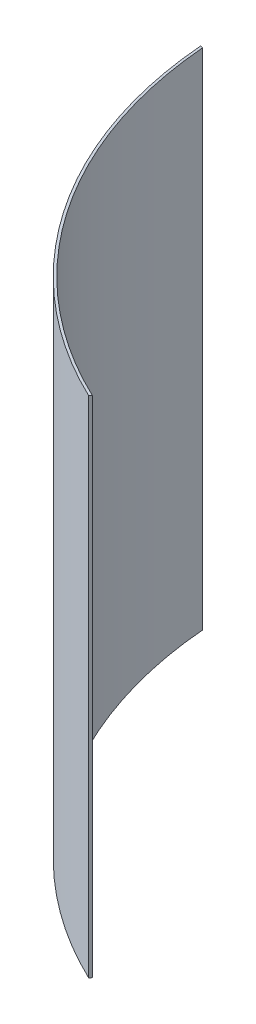
ISO-10303-21;
HEADER;
FILE_DESCRIPTION(('STEP AP214'),'2;1');
FILE_NAME('part.step','',(''),(''),'','','');
FILE_SCHEMA(('AUTOMOTIVE_DESIGN { 1 0 10303 214 1 1 1 1 }'));
ENDSEC;
DATA;
#1=APPLICATION_CONTEXT('core data for automotive mechanical design processes');
#2=APPLICATION_PROTOCOL_DEFINITION('international standard','automotive_design',2000,#1);
#3=PRODUCT_CONTEXT('',#1,'mechanical');
#4=PRODUCT('Part','Part','',(#3));
#5=PRODUCT_RELATED_PRODUCT_CATEGORY('part','',(#4));
#6=PRODUCT_DEFINITION_FORMATION('','',#4);
#7=PRODUCT_DEFINITION_CONTEXT('part definition',#1,'design');
#8=PRODUCT_DEFINITION('design','',#6,#7);
#9=PRODUCT_DEFINITION_SHAPE('','',#8);
#10=(LENGTH_UNIT() NAMED_UNIT(*) SI_UNIT(.MILLI.,.METRE.));
#11=(NAMED_UNIT(*) PLANE_ANGLE_UNIT() SI_UNIT($,.RADIAN.));
#12=(NAMED_UNIT(*) SI_UNIT($,.STERADIAN.) SOLID_ANGLE_UNIT());
#13=UNCERTAINTY_MEASURE_WITH_UNIT(LENGTH_MEASURE(1.E-05),#10,'distance_accuracy_value','');
#14=(GEOMETRIC_REPRESENTATION_CONTEXT(3) GLOBAL_UNCERTAINTY_ASSIGNED_CONTEXT((#13)) GLOBAL_UNIT_ASSIGNED_CONTEXT((#10,
#11,#12)) REPRESENTATION_CONTEXT('',''));
#15=CARTESIAN_POINT('',(0.,0.,0.));
#16=DIRECTION('',(0.,0.,1.));
#17=DIRECTION('',(1.,0.,0.));
#18=AXIS2_PLACEMENT_3D('',#15,#16,#17);
#19=CARTESIAN_POINT('',(0.,2025.87,0.));
#20=DIRECTION('',(0.,-1.,0.));
#21=DIRECTION('',(0.,0.,-1.));
#22=AXIS2_PLACEMENT_3D('',#19,#20,#21);
#23=CYLINDRICAL_SURFACE('',#22,1750.);
#24=CARTESIAN_POINT('',(0.,0.,0.));
#25=DIRECTION('',(0.,1.,0.));
#26=DIRECTION('',(0.,0.,-1.));
#27=AXIS2_PLACEMENT_3D('',#24,#25,#26);
#28=CIRCLE('',#27,1750.);
#29=CARTESIAN_POINT('',(-1744.50664790627,0.,138.551634457456));
#30=VERTEX_POINT('',#29);
#31=CARTESIAN_POINT('',(-752.264088777141,0.,1580.06289138638));
#32=VERTEX_POINT('',#31);
#33=EDGE_CURVE('E101',#30,#32,#28,.T.);
#34=ORIENTED_EDGE('',*,*,#33,.T.);
#35=DIRECTION('',(0.,-1.,0.));
#36=VECTOR('',#35,1.);
#37=CARTESIAN_POINT('',(-752.264088777141,2025.87,1580.06289138638));
#38=LINE('',#37,#36);
#39=CARTESIAN_POINT('',(-752.264088777141,2025.87,1580.06289138638));
#40=VERTEX_POINT('',#39);
#41=EDGE_CURVE('E11',#40,#32,#38,.T.);
#42=ORIENTED_EDGE('',*,*,#41,.F.);
#43=CARTESIAN_POINT('',(0.,2025.87,0.));
#44=DIRECTION('',(0.,1.,0.));
#45=DIRECTION('',(0.,0.,-1.));
#46=AXIS2_PLACEMENT_3D('',#43,#44,#45);
#47=CIRCLE('',#46,1750.);
#48=CARTESIAN_POINT('',(-1744.50664790627,2025.87,138.551634457456));
#49=VERTEX_POINT('',#48);
#50=EDGE_CURVE('E89',#49,#40,#47,.T.);
#51=ORIENTED_EDGE('',*,*,#50,.F.);
#52=DIRECTION('',(0.,-1.,0.));
#53=VECTOR('',#52,1.);
#54=CARTESIAN_POINT('',(-1744.50664790627,2025.87,138.551634457456));
#55=LINE('',#54,#53);
#56=EDGE_CURVE('E97',#49,#30,#55,.T.);
#57=ORIENTED_EDGE('',*,*,#56,.T.);
#58=EDGE_LOOP('',(#34,#42,#51,#57));
#59=FACE_BOUND('',#58,.T.);
#60=ADVANCED_FACE('F38',(#59),#23,.T.);
#61=CARTESIAN_POINT('',(-746.168093899805,2025.87,1571.88863652708));
#62=DIRECTION('',(-0.801630275834597,0.,-0.59782012417227));
#63=DIRECTION('',(-0.59782012417227,0.,0.801630275834597));
#64=AXIS2_PLACEMENT_3D('',#61,#62,#63);
#65=PLANE('',#64);
#66=DIRECTION('',(0.59782012417227,0.,-0.801630275834597));
#67=VECTOR('',#66,1.);
#68=CARTESIAN_POINT('',(-746.168093899805,0.,1571.88863652708));
#69=LINE('',#68,#67);
#70=CARTESIAN_POINT('',(-746.168093899805,0.,1571.88863652708));
#71=VERTEX_POINT('',#70);
#72=EDGE_CURVE('E93',#32,#71,#69,.T.);
#73=ORIENTED_EDGE('',*,*,#72,.T.);
#74=DIRECTION('',(0.,-1.,0.));
#75=VECTOR('',#74,1.);
#76=CARTESIAN_POINT('',(-746.168093899805,2025.87,1571.88863652708));
#77=LINE('',#76,#75);
#78=CARTESIAN_POINT('',(-746.168093899805,2025.87,1571.88863652708));
#79=VERTEX_POINT('',#78);
#80=EDGE_CURVE('E46',#79,#71,#77,.T.);
#81=ORIENTED_EDGE('',*,*,#80,.F.);
#82=DIRECTION('',(0.59782012417227,0.,-0.801630275834597));
#83=VECTOR('',#82,1.);
#84=CARTESIAN_POINT('',(-746.168093899805,2025.87,1571.88863652708));
#85=LINE('',#84,#83);
#86=EDGE_CURVE('E84',#40,#79,#85,.T.);
#87=ORIENTED_EDGE('',*,*,#86,.F.);
#88=ORIENTED_EDGE('',*,*,#41,.T.);
#89=EDGE_LOOP('',(#73,#81,#87,#88));
#90=FACE_BOUND('',#89,.T.);
#91=ADVANCED_FACE('F92',(#90),#65,.F.);
#92=CARTESIAN_POINT('',(0.,2025.87,0.));
#93=DIRECTION('',(0.,-1.,0.));
#94=DIRECTION('',(0.,0.,-1.));
#95=AXIS2_PLACEMENT_3D('',#92,#93,#94);
#96=CYLINDRICAL_SURFACE('',#95,1740.00020402212);
#97=CARTESIAN_POINT('',(0.,0.,0.));
#98=DIRECTION('',(0.,-1.,0.));
#99=DIRECTION('',(0.,0.,1.));
#100=AXIS2_PLACEMENT_3D('',#97,#98,#99);
#101=CIRCLE('',#100,1740.00020402212);
#102=CARTESIAN_POINT('',(-1734.35470829535,0.,140.051618379776));
#103=VERTEX_POINT('',#102);
#104=EDGE_CURVE('E71',#71,#103,#101,.T.);
#105=ORIENTED_EDGE('',*,*,#104,.T.);
#106=DIRECTION('',(0.,-1.,0.));
#107=VECTOR('',#106,1.);
#108=CARTESIAN_POINT('',(-1734.35470829535,2025.87,140.051618379776));
#109=LINE('',#108,#107);
#110=CARTESIAN_POINT('',(-1734.35470829535,2025.87,140.051618379776));
#111=VERTEX_POINT('',#110);
#112=EDGE_CURVE('E94',#111,#103,#109,.T.);
#113=ORIENTED_EDGE('',*,*,#112,.F.);
#114=CARTESIAN_POINT('',(0.,2025.87,0.));
#115=DIRECTION('',(0.,-1.,0.));
#116=DIRECTION('',(0.,0.,1.));
#117=AXIS2_PLACEMENT_3D('',#114,#115,#116);
#118=CIRCLE('',#117,1740.00020402212);
#119=EDGE_CURVE('E87',#79,#111,#118,.T.);
#120=ORIENTED_EDGE('',*,*,#119,.F.);
#121=ORIENTED_EDGE('',*,*,#80,.T.);
#122=EDGE_LOOP('',(#105,#113,#120,#121));
#123=FACE_BOUND('',#122,.T.);
#124=ADVANCED_FACE('F95',(#123),#96,.F.);
#125=CARTESIAN_POINT('',(-1744.50664790627,2025.87,138.551634457456));
#126=DIRECTION('',(-0.146166559662923,0.,0.989259994559724));
#127=DIRECTION('',(0.989259994559724,0.,0.146166559662923));
#128=AXIS2_PLACEMENT_3D('',#125,#126,#127);
#129=PLANE('',#128);
#130=DIRECTION('',(-0.989259994559724,0.,-0.146166559662923));
#131=VECTOR('',#130,1.);
#132=CARTESIAN_POINT('',(-1744.50664790627,0.,138.551634457456));
#133=LINE('',#132,#131);
#134=EDGE_CURVE('E77',#103,#30,#133,.T.);
#135=ORIENTED_EDGE('',*,*,#134,.T.);
#136=ORIENTED_EDGE('',*,*,#56,.F.);
#137=DIRECTION('',(-0.989259994559724,0.,-0.146166559662923));
#138=VECTOR('',#137,1.);
#139=CARTESIAN_POINT('',(-1744.50664790627,2025.87,138.551634457456));
#140=LINE('',#139,#138);
#141=EDGE_CURVE('E54',#111,#49,#140,.T.);
#142=ORIENTED_EDGE('',*,*,#141,.F.);
#143=ORIENTED_EDGE('',*,*,#112,.T.);
#144=EDGE_LOOP('',(#135,#136,#142,#143));
#145=FACE_BOUND('',#144,.T.);
#146=ADVANCED_FACE('F108',(#145),#129,.F.);
#147=CARTESIAN_POINT('',(0.,2025.87,0.));
#148=DIRECTION('',(0.,-1.,0.));
#149=DIRECTION('',(0.,0.,-1.));
#150=AXIS2_PLACEMENT_3D('',#147,#148,#149);
#151=PLANE('',#150);
#152=ORIENTED_EDGE('',*,*,#50,.T.);
#153=ORIENTED_EDGE('',*,*,#86,.T.);
#154=ORIENTED_EDGE('',*,*,#119,.T.);
#155=ORIENTED_EDGE('',*,*,#141,.T.);
#156=EDGE_LOOP('',(#152,#153,#154,#155));
#157=FACE_BOUND('',#156,.T.);
#158=ADVANCED_FACE('F85',(#157),#151,.F.);
#159=CARTESIAN_POINT('',(0.,0.,0.));
#160=DIRECTION('',(0.,-1.,0.));
#161=DIRECTION('',(0.,0.,-1.));
#162=AXIS2_PLACEMENT_3D('',#159,#160,#161);
#163=PLANE('',#162);
#164=ORIENTED_EDGE('',*,*,#33,.F.);
#165=ORIENTED_EDGE('',*,*,#134,.F.);
#166=ORIENTED_EDGE('',*,*,#104,.F.);
#167=ORIENTED_EDGE('',*,*,#72,.F.);
#168=EDGE_LOOP('',(#164,#165,#166,#167));
#169=FACE_BOUND('',#168,.T.);
#170=ADVANCED_FACE('F111',(#169),#163,.T.);
#171=CLOSED_SHELL('',(#60,#91,#124,#146,#158,#170));
#172=MANIFOLD_SOLID_BREP('B2',#171);
#173=ADVANCED_BREP_SHAPE_REPRESENTATION('',(#18,#172),#14);
#174=SHAPE_DEFINITION_REPRESENTATION(#9,#173);
ENDSEC;
END-ISO-10303-21;
